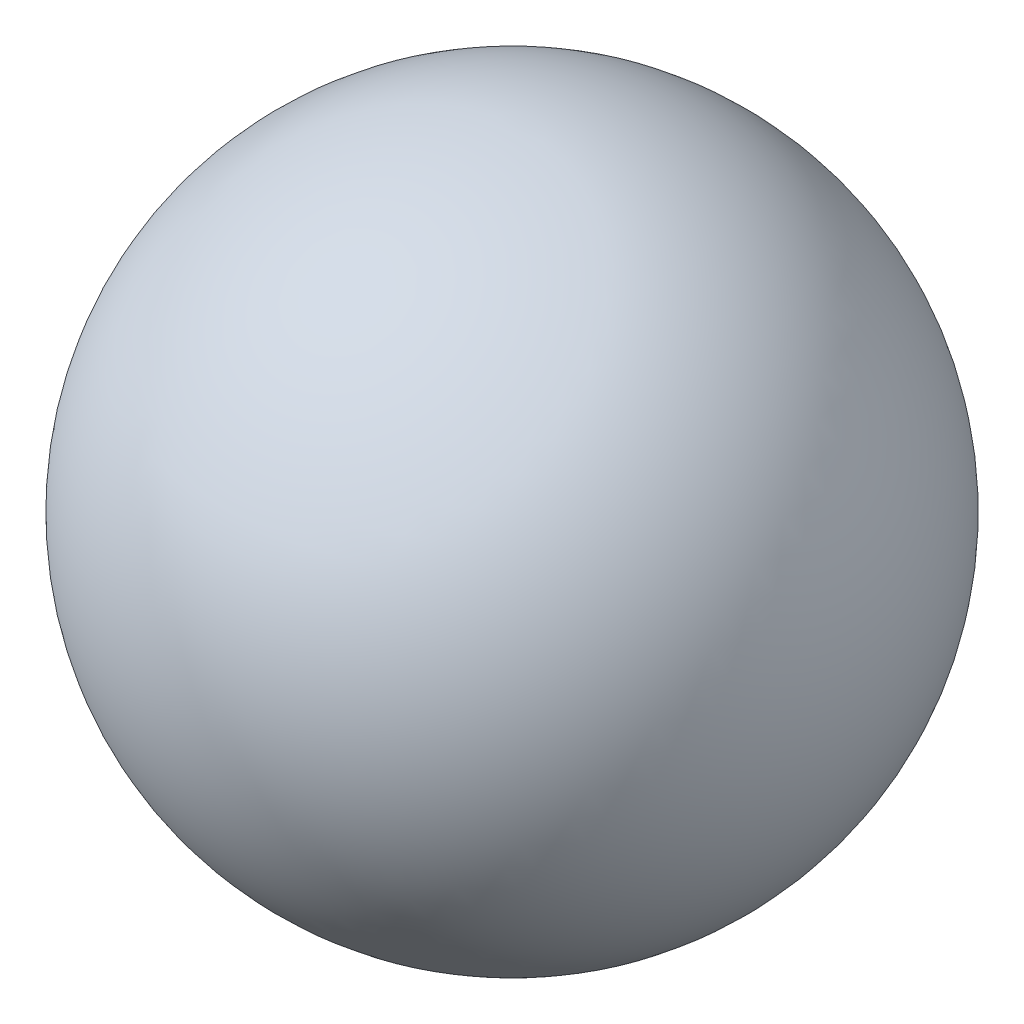
ISO-10303-21;
HEADER;
FILE_DESCRIPTION(('STEP AP214'),'2;1');
FILE_NAME('part.step','',(''),(''),'','','');
FILE_SCHEMA(('AUTOMOTIVE_DESIGN { 1 0 10303 214 1 1 1 1 }'));
ENDSEC;
DATA;
#1=APPLICATION_CONTEXT('core data for automotive mechanical design processes');
#2=APPLICATION_PROTOCOL_DEFINITION('international standard','automotive_design',2000,#1);
#3=PRODUCT_CONTEXT('',#1,'mechanical');
#4=PRODUCT('Part','Part','',(#3));
#5=PRODUCT_RELATED_PRODUCT_CATEGORY('part','',(#4));
#6=PRODUCT_DEFINITION_FORMATION('','',#4);
#7=PRODUCT_DEFINITION_CONTEXT('part definition',#1,'design');
#8=PRODUCT_DEFINITION('design','',#6,#7);
#9=PRODUCT_DEFINITION_SHAPE('','',#8);
#10=(LENGTH_UNIT() NAMED_UNIT(*) SI_UNIT(.MILLI.,.METRE.));
#11=(NAMED_UNIT(*) PLANE_ANGLE_UNIT() SI_UNIT($,.RADIAN.));
#12=(NAMED_UNIT(*) SI_UNIT($,.STERADIAN.) SOLID_ANGLE_UNIT());
#13=UNCERTAINTY_MEASURE_WITH_UNIT(LENGTH_MEASURE(1.E-05),#10,'distance_accuracy_value','');
#14=(GEOMETRIC_REPRESENTATION_CONTEXT(3) GLOBAL_UNCERTAINTY_ASSIGNED_CONTEXT((#13)) GLOBAL_UNIT_ASSIGNED_CONTEXT((#10,
#11,#12)) REPRESENTATION_CONTEXT('',''));
#15=CARTESIAN_POINT('',(0.,0.,0.));
#16=DIRECTION('',(0.,0.,1.));
#17=DIRECTION('',(1.,0.,0.));
#18=AXIS2_PLACEMENT_3D('',#15,#16,#17);
#19=CARTESIAN_POINT('',(0.,0.,0.));
#20=DIRECTION('',(0.,1.,0.));
#21=DIRECTION('',(1.,0.,0.));
#22=AXIS2_PLACEMENT_3D('',#19,#20,#21);
#23=SPHERICAL_SURFACE('',#22,7.493);
#24=CARTESIAN_POINT('',(0.,7.493,0.));
#25=VERTEX_POINT('',#24);
#26=VERTEX_LOOP('',#25);
#27=FACE_BOUND('',#26,.T.);
#28=ADVANCED_FACE('F29',(#27),#23,.T.);
#29=CLOSED_SHELL('',(#28));
#30=MANIFOLD_SOLID_BREP('B2',#29);
#31=ADVANCED_BREP_SHAPE_REPRESENTATION('',(#18,#30),#14);
#32=SHAPE_DEFINITION_REPRESENTATION(#9,#31);
ENDSEC;
END-ISO-10303-21;
